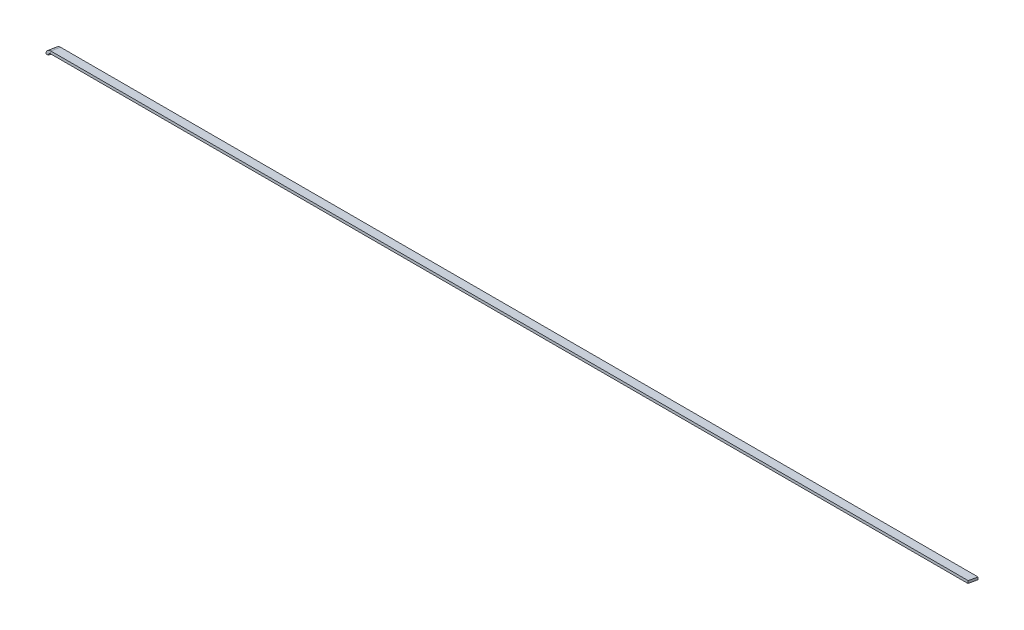
ISO-10303-21;
HEADER;
FILE_DESCRIPTION(('STEP AP214'),'2;1');
FILE_NAME('part.step','',(''),(''),'','','');
FILE_SCHEMA(('AUTOMOTIVE_DESIGN { 1 0 10303 214 1 1 1 1 }'));
ENDSEC;
DATA;
#1=APPLICATION_CONTEXT('core data for automotive mechanical design processes');
#2=APPLICATION_PROTOCOL_DEFINITION('international standard','automotive_design',2000,#1);
#3=PRODUCT_CONTEXT('',#1,'mechanical');
#4=PRODUCT('Part','Part','',(#3));
#5=PRODUCT_RELATED_PRODUCT_CATEGORY('part','',(#4));
#6=PRODUCT_DEFINITION_FORMATION('','',#4);
#7=PRODUCT_DEFINITION_CONTEXT('part definition',#1,'design');
#8=PRODUCT_DEFINITION('design','',#6,#7);
#9=PRODUCT_DEFINITION_SHAPE('','',#8);
#10=(LENGTH_UNIT() NAMED_UNIT(*) SI_UNIT(.MILLI.,.METRE.));
#11=(NAMED_UNIT(*) PLANE_ANGLE_UNIT() SI_UNIT($,.RADIAN.));
#12=(NAMED_UNIT(*) SI_UNIT($,.STERADIAN.) SOLID_ANGLE_UNIT());
#13=UNCERTAINTY_MEASURE_WITH_UNIT(LENGTH_MEASURE(1.E-05),#10,'distance_accuracy_value','');
#14=(GEOMETRIC_REPRESENTATION_CONTEXT(3) GLOBAL_UNCERTAINTY_ASSIGNED_CONTEXT((#13)) GLOBAL_UNIT_ASSIGNED_CONTEXT((#10,
#11,#12)) REPRESENTATION_CONTEXT('',''));
#15=CARTESIAN_POINT('',(0.,0.,0.));
#16=DIRECTION('',(0.,0.,1.));
#17=DIRECTION('',(1.,0.,0.));
#18=AXIS2_PLACEMENT_3D('',#15,#16,#17);
#19=CARTESIAN_POINT('',(52.41935881812,-96.32813489201,-536.6847549942));
#20=DIRECTION('',(-0.0868265938642471,0.0868265938642471,0.992432509138967));
#21=DIRECTION('',(0.996194698091746,0.,0.0871557427476577));
#22=AXIS2_PLACEMENT_3D('',#19,#20,#21);
#23=CYLINDRICAL_SURFACE('',#22,0.5);
#24=DIRECTION('',(0.0868267461894329,-0.0868265927071715,-0.99243249591346));
#25=VECTOR('',#24,1.);
#26=CARTESIAN_POINT('',(-5.17197063873012,-38.2387079825568,121.543576195394));
#27=LINE('',#26,#25);
#28=CARTESIAN_POINT('',(-5.17197055575533,-38.2387079591977,121.543576462841));
#29=VERTEX_POINT('',#28);
#30=CARTESIAN_POINT('',(-5.01067835047329,-38.4000000719543,119.699999176918));
#31=VERTEX_POINT('',#30);
#32=EDGE_CURVE('E95',#29,#31,#27,.T.);
#33=ORIENTED_EDGE('',*,*,#32,.F.);
#34=CARTESIAN_POINT('',(-5.17197040511566,-38.2387078125537,121.543578138599));
#35=CARTESIAN_POINT('',(-5.19972220287751,-38.2384726883979,121.54595633283));
#36=CARTESIAN_POINT('',(-5.22751840218116,-38.240583946407,121.54803719256));
#37=CARTESIAN_POINT('',(-5.28240384099066,-38.2493878052973,121.551648781658));
#38=CARTESIAN_POINT('',(-5.30949328184964,-38.2560790862169,121.553179669333));
#39=CARTESIAN_POINT('',(-5.3622110479099,-38.2739399330749,121.555738370536));
#40=CARTESIAN_POINT('',(-5.38783797892337,-38.2851136932458,121.556765710891));
#41=CARTESIAN_POINT('',(-5.43683707376779,-38.3116355321225,121.558341634583));
#42=CARTESIAN_POINT('',(-5.46021006185181,-38.3269820769646,121.558890393528));
#43=CARTESIAN_POINT('',(-5.50378872979201,-38.3612397034985,121.55952664386));
#44=CARTESIAN_POINT('',(-5.52402501260756,-38.3801117772388,121.559618905135));
#45=CARTESIAN_POINT('',(-5.56103983357595,-38.4209843724841,121.559359629411));
#46=CARTESIAN_POINT('',(-5.57781846124076,-38.4429848129769,121.559008103903));
#47=CARTESIAN_POINT('',(-5.6073857168609,-38.4893793953034,121.557846690681));
#48=CARTESIAN_POINT('',(-5.62019038736903,-38.5137633761151,121.557038684044));
#49=CARTESIAN_POINT('',(-5.64156452191768,-38.5643009598548,121.554944044324));
#50=CARTESIAN_POINT('',(-5.65013511017269,-38.5904540909469,121.55365753845));
#51=CARTESIAN_POINT('',(-5.66116406351586,-38.6367210177447,121.550980726654));
#52=CARTESIAN_POINT('',(-5.66463874149392,-38.6566063231496,121.549707498963));
#53=CARTESIAN_POINT('',(-5.66916718802389,-38.6966020435347,121.546867447155));
#54=CARTESIAN_POINT('',(-5.67022432089077,-38.7167121064986,121.545301034332));
#55=CARTESIAN_POINT('',(-5.6700682375968,-38.7368053477638,121.543577867252));
#56=B_SPLINE_CURVE_WITH_KNOTS('',3,(#34,#35,#36,#37,#38,#39,#40,#41,#42,#43,#44,#45,#46,#47,#48,
#49,#50,#51,#52,#53,#54,#55),.UNSPECIFIED.,.F.,.F.,(4,2,2,2,2,2,2,2,2,2,4),(0.,
0.0834672921241461,0.16691053911659,0.250432046318439,0.333922893462488,0.416539485111989,
0.499153937709975,0.581430408668102,0.663685022190623,0.724223293279798,0.784677266428535),.UNSPECIFIED.);
#57=CARTESIAN_POINT('',(-5.67006823754738,-38.7368053477605,121.543577867226));
#58=VERTEX_POINT('',#57);
#59=EDGE_CURVE('E24',#29,#58,#56,.T.);
#60=ORIENTED_EDGE('',*,*,#59,.T.);
#61=DIRECTION('',(-0.086826594005677,0.0868265938642385,0.992432509126595));
#62=VECTOR('',#61,1.);
#63=CARTESIAN_POINT('',(-5.50877607324944,-38.898097511743,119.699999996839));
#64=LINE('',#63,#62);
#65=CARTESIAN_POINT('',(-5.50877607296511,-38.8980975116285,119.699999991538));
#66=VERTEX_POINT('',#65);
#67=EDGE_CURVE('E101',#66,#58,#64,.T.);
#68=ORIENTED_EDGE('',*,*,#67,.F.);
#69=CARTESIAN_POINT('',(-5.50877607268078,-38.8980975115139,119.699999986236));
#70=CARTESIAN_POINT('',(-5.50879765994219,-38.8699809162158,119.700006630051));
#71=CARTESIAN_POINT('',(-5.50641474109959,-38.8418748740012,119.700010778274));
#72=CARTESIAN_POINT('',(-5.49700064036064,-38.7865418735219,119.70001584724));
#73=CARTESIAN_POINT('',(-5.48998390480496,-38.7593124581065,119.700016777959));
#74=CARTESIAN_POINT('',(-5.47157832414516,-38.7067411869035,119.700017192252));
#75=CARTESIAN_POINT('',(-5.4602458936271,-38.6813798148727,119.700016693979));
#76=CARTESIAN_POINT('',(-5.4402547992537,-38.6450858478842,119.700014385166));
#77=CARTESIAN_POINT('',(-5.43310367204059,-38.6332935093817,119.70001335769));
#78=CARTESIAN_POINT('',(-5.41023943094516,-38.5989164300088,119.700009275337));
#79=CARTESIAN_POINT('',(-5.39308067511347,-38.5772539574586,119.700005220406));
#80=CARTESIAN_POINT('',(-5.36490228404933,-38.5471851009634,119.699999971807));
#81=CARTESIAN_POINT('',(-5.35511711352177,-38.5375772416292,119.699998362797));
#82=CARTESIAN_POINT('',(-5.32454716050016,-38.5099559870637,119.699995545983));
#83=CARTESIAN_POINT('',(-5.30259283440001,-38.4932014703541,119.699996367285));
#84=CARTESIAN_POINT('',(-5.25621490225502,-38.4635632574624,119.699999743904));
#85=CARTESIAN_POINT('',(-5.23179131751778,-38.4506795278825,119.700002299206));
#86=CARTESIAN_POINT('',(-5.19388254967836,-38.4345321162787,119.700005712372));
#87=CARTESIAN_POINT('',(-5.18105159653024,-38.4296835983239,119.700006779013));
#88=CARTESIAN_POINT('',(-5.11759402120296,-38.4086491162974,119.700010960414));
#89=CARTESIAN_POINT('',(-5.06443654458955,-38.399978889005,119.700011138459));
#90=CARTESIAN_POINT('',(-5.01067811407178,-38.3999999999183,119.700000000995));
#91=B_SPLINE_CURVE_WITH_KNOTS('',3,(#69,#70,#71,#72,#73,#74,#75,#76,#77,#78,#79,#80,#81,#82,#83,
#84,#85,#86,#87,#88,#89,#90),.UNSPECIFIED.,.F.,.F.,(4,2,2,2,2,2,2,2,2,2,4),(0.,
0.0842298513350223,0.168198340399447,0.251104912953752,0.292450068290602,0.374887932500182,
0.415999833054676,0.498437726311945,0.580874908260832,0.621986558622702,0.781380797754757),.UNSPECIFIED.);
#92=EDGE_CURVE('E85',#66,#31,#91,.T.);
#93=ORIENTED_EDGE('',*,*,#92,.T.);
#94=EDGE_LOOP('',(#33,#60,#68,#93));
#95=FACE_BOUND('',#94,.T.);
#96=ADVANCED_FACE('F17',(#95),#23,.F.);
#97=CARTESIAN_POINT('',(-5.112569675134,-38.47541771009,121.5479394711));
#98=CARTESIAN_POINT('',(-5.044486580042,-38.16396532369,121.5266461423));
#99=CARTESIAN_POINT('',(-4.976403484949,-37.85251293728,121.5053528136));
#100=CARTESIAN_POINT('',(-4.908320389856,-37.54106055088,121.4840594848));
#101=CARTESIAN_POINT('',(-5.132151056064,-38.47050991599,121.5538502431));
#102=CARTESIAN_POINT('',(-5.086414288446,-38.15407199933,121.5301655596));
#103=CARTESIAN_POINT('',(-5.040677520828,-37.83763408266,121.506480876));
#104=CARTESIAN_POINT('',(-4.99494075321,-37.521196166,121.4827961925));
#105=CARTESIAN_POINT('',(-5.200266491454,-38.46164018996,121.5716413278));
#106=CARTESIAN_POINT('',(-5.232618831878,-38.13720868905,121.5404252146));
#107=CARTESIAN_POINT('',(-5.264971172301,-37.81277718814,121.5092091014));
#108=CARTESIAN_POINT('',(-5.297323512724,-37.48834568722,121.4779929882));
#109=CARTESIAN_POINT('',(-5.315120027272,-38.49030514313,121.5886289005));
#110=CARTESIAN_POINT('',(-5.480858717124,-38.20228867929,121.5489295976));
#111=CARTESIAN_POINT('',(-5.646597406976,-37.91427221545,121.5092302947));
#112=CARTESIAN_POINT('',(-5.812336096828,-37.6262557516,121.4695309918));
#113=CARTESIAN_POINT('',(-5.418451545368,-38.59361039623,121.5886484445));
#114=CARTESIAN_POINT('',(-5.706442895095,-38.42781993132,121.5489470994));
#115=CARTESIAN_POINT('',(-5.994434244823,-38.2620294664,121.5092457543));
#116=CARTESIAN_POINT('',(-6.28242559455,-38.09623900149,121.4695444091));
#117=CARTESIAN_POINT('',(-5.44741610376,-38.70959777021,121.5714819641));
#118=CARTESIAN_POINT('',(-5.772202737519,-38.67850933872,121.5403470572));
#119=CARTESIAN_POINT('',(-6.096989371278,-38.64742090723,121.5092121503));
#120=CARTESIAN_POINT('',(-6.421776005036,-38.61633247574,121.4780772434));
#121=CARTESIAN_POINT('',(-5.437965666557,-38.77887810011,121.5532562447));
#122=CARTESIAN_POINT('',(-5.754131515095,-38.82719714972,121.5298226307));
#123=CARTESIAN_POINT('',(-6.070297363634,-38.87551619933,121.5063890168));
#124=CARTESIAN_POINT('',(-6.386463212172,-38.92383524893,121.4829554028));
#125=CARTESIAN_POINT('',(-5.432504216162,-38.79952284327,121.546928232));
#126=CARTESIAN_POINT('',(-5.743086428147,-38.87138938096,121.5260431179));
#127=CARTESIAN_POINT('',(-6.053668640132,-38.94325591866,121.5051580037));
#128=CARTESIAN_POINT('',(-6.364250852116,-39.01512245635,121.4842728895));
#129=B_SPLINE_SURFACE_WITH_KNOTS('',3,3,((#97,#98,#99,#100),(#101,#102,#103,#104),(#105,#106,
#107,#108),(#109,#110,#111,#112),(#113,#114,#115,#116),(#117,#118,#119,#120),(#121,#122,#123,
#124),(#125,#126,#127,#128)),.UNSPECIFIED.,.F.,.F.,.F.,(4,1,1,1,1,4),(4,4),(0.09907117927803,
0.1856172221288,0.3946265594904,0.6036358968522,0.8126452342138,0.9040364762453),
(0.005541150635362,0.7988602237158),.UNSPECIFIED.);
#130=CARTESIAN_POINT('',(-6.16816558786832,-38.7368055089523,121.500000009887));
#131=CARTESIAN_POINT('',(-6.16816576184903,-38.7087438103357,121.500003255809));
#132=CARTESIAN_POINT('',(-6.16698621756349,-38.6806952711927,121.499978508677));
#133=CARTESIAN_POINT('',(-6.16227601287146,-38.6247971107316,121.499888428137));
#134=CARTESIAN_POINT('',(-6.15874540709441,-38.5969474848069,121.499823095672));
#135=CARTESIAN_POINT('',(-6.14465381938358,-38.5140387684586,121.499589555745));
#136=CARTESIAN_POINT('',(-6.13059300570216,-38.4595327034948,121.499383721116));
#137=CARTESIAN_POINT('',(-6.09350702592433,-38.3536545907043,121.498974860905));
#138=CARTESIAN_POINT('',(-6.0704765195511,-38.3022844310133,121.498771837071));
#139=CARTESIAN_POINT('',(-6.01609612406021,-38.2041577211165,121.49843570573));
#140=CARTESIAN_POINT('',(-5.9847481191383,-38.1574001292942,121.498302582408));
#141=CARTESIAN_POINT('',(-5.91472070695153,-38.0699526222906,121.498149602284));
#142=CARTESIAN_POINT('',(-5.87606036772105,-38.0292474070149,121.498129454977));
#143=CARTESIAN_POINT('',(-5.7924234949847,-37.9549006773107,121.498209360105));
#144=CARTESIAN_POINT('',(-5.74744707919719,-37.9212590312613,121.4983094103));
#145=CARTESIAN_POINT('',(-5.67628207925127,-37.8768463889765,121.498523817443));
#146=CARTESIAN_POINT('',(-5.65193527690781,-37.8630470235084,121.498606045184));
#147=CARTESIAN_POINT('',(-5.60219165522934,-37.8375557816904,121.498784931524));
#148=CARTESIAN_POINT('',(-5.57679579113229,-37.8258620378668,121.498881577197));
#149=CARTESIAN_POINT('',(-5.49926819178859,-37.7940591424291,121.499181947329));
#150=CARTESIAN_POINT('',(-5.44574911323243,-37.7771988493341,121.49939627453));
#151=CARTESIAN_POINT('',(-5.35526099458943,-37.75684686416,121.499699162428));
#152=CARTESIAN_POINT('',(-5.31884434890358,-37.7507596103966,121.499805714937));
#153=CARTESIAN_POINT('',(-5.24561571666127,-37.7426429227936,121.499956763468));
#154=CARTESIAN_POINT('',(-5.20880439169978,-37.7406075230348,121.500001350697));
#155=CARTESIAN_POINT('',(-5.17197069254263,-37.7406106554667,121.499998073121));
#156=B_SPLINE_CURVE_WITH_KNOTS('',3,(#130,#131,#132,#133,#134,#135,#136,#137,#138,#139,#140,
#141,#142,#143,#144,#145,#146,#147,#148,#149,#150,#151,#152,#153,#154,#155),.UNSPECIFIED.,.F.,
.F.,(4,2,2,2,2,2,2,2,2,2,2,2,4),(0.,0.0841339446855841,0.168265934496953,0.336271822615515,
0.504377889511799,0.672445907143272,0.840081557498182,1.00771408389245,1.09158418543019,
1.17537953229231,1.34280499255545,1.45336828011326,1.56376865435896),.UNSPECIFIED.);
#157=CARTESIAN_POINT('',(-6.16816558786483,-38.7368055083495,121.500000009848));
#158=VERTEX_POINT('',#157);
#159=CARTESIAN_POINT('',(-5.17197069082768,-37.740610706025,121.499997495172));
#160=VERTEX_POINT('',#159);
#161=EDGE_CURVE('E106',#158,#160,#156,.T.);
#162=DIRECTION('',(-0.996194700555619,-3.22370768909132E-07,-0.0871557145848507));
#163=VECTOR('',#162,1.);
#164=CARTESIAN_POINT('',(-5.67006823749798,-38.7368053477572,121.5435778672));
#165=LINE('',#164,#163);
#166=EDGE_CURVE('E80',#58,#158,#165,.T.);
#167=DIRECTION('',(0.,-0.996194698095335,0.0871557427066331));
#168=VECTOR('',#167,1.);
#169=CARTESIAN_POINT('',(-5.171970706395,-37.98965943124,121.5217858514));
#170=LINE('',#169,#168);
#171=EDGE_CURVE('E78',#160,#29,#170,.T.);
#172=ORIENTED_EDGE('',*,*,#161,.F.);
#173=ORIENTED_EDGE('',*,*,#166,.F.);
#174=ORIENTED_EDGE('',*,*,#59,.F.);
#175=ORIENTED_EDGE('',*,*,#171,.F.);
#176=EDGE_LOOP('',(#172,#173,#174,#175));
#177=FACE_BOUND('',#176,.T.);
#178=ADVANCED_FACE('F77',(#177),#129,.F.);
#179=CARTESIAN_POINT('',(-5.508755852196,-38.89809751128,119.7000017553));
#180=CARTESIAN_POINT('',(-5.674805654029,-38.89809756532,119.6854742735));
#181=CARTESIAN_POINT('',(-5.840855455862,-38.89809761937,119.6709467918));
#182=CARTESIAN_POINT('',(-6.006905257696,-38.89809767341,119.65641931));
#183=CARTESIAN_POINT('',(-5.508760617186,-38.8544017485,119.7000109825));
#184=CARTESIAN_POINT('',(-5.674703529684,-38.84000586102,119.6842299089));
#185=CARTESIAN_POINT('',(-5.840646442181,-38.82560997355,119.6684488354));
#186=CARTESIAN_POINT('',(-6.006589354678,-38.81121408608,119.6526677618));
#187=CARTESIAN_POINT('',(-5.49731079232,-38.76716292597,119.7000216717));
#188=CARTESIAN_POINT('',(-5.659265485849,-38.72395986644,119.6820652055));
#189=CARTESIAN_POINT('',(-5.821220179378,-38.68075680692,119.6641087393));
#190=CARTESIAN_POINT('',(-5.983174872907,-38.63755374739,119.6461522731));
#191=CARTESIAN_POINT('',(-5.446768599709,-38.64532302812,119.7000206451));
#192=CARTESIAN_POINT('',(-5.591847771949,-38.56182580232,119.6800153623));
#193=CARTESIAN_POINT('',(-5.736926944188,-38.47832857651,119.6600100796));
#194=CARTESIAN_POINT('',(-5.882006116427,-38.3948313507,119.6400047968));
#195=CARTESIAN_POINT('',(-5.367012648338,-38.5415361521,119.6999987719));
#196=CARTESIAN_POINT('',(-5.485337511826,-38.42325027185,119.6792982154));
#197=CARTESIAN_POINT('',(-5.603662375314,-38.3049643916,119.6585976588));
#198=CARTESIAN_POINT('',(-5.721987238802,-38.18667851135,119.6378971022));
#199=CARTESIAN_POINT('',(-5.262851043244,-38.4616687018,119.7000005201));
#200=CARTESIAN_POINT('',(-5.3464513903,-38.31664768838,119.6799978271));
#201=CARTESIAN_POINT('',(-5.430051737356,-38.17162667495,119.6599951341));
#202=CARTESIAN_POINT('',(-5.513652084413,-38.02660566153,119.6399924411));
#203=CARTESIAN_POINT('',(-5.141547898129,-38.41149872191,119.7000139057));
#204=CARTESIAN_POINT('',(-5.184761965535,-38.24953844761,119.6820571144));
#205=CARTESIAN_POINT('',(-5.22797603294,-38.08757817331,119.6641003231));
#206=CARTESIAN_POINT('',(-5.271190100345,-37.92561789902,119.6461435319));
#207=CARTESIAN_POINT('',(-5.054363473588,-38.40001551403,119.7000104189));
#208=CARTESIAN_POINT('',(-5.068760914962,-38.23407279721,119.6842273341));
#209=CARTESIAN_POINT('',(-5.083158356337,-38.06813008039,119.6684442492));
#210=CARTESIAN_POINT('',(-5.097555797712,-37.90218736357,119.6526611644));
#211=CARTESIAN_POINT('',(-5.010678120263,-38.40002027704,119.7000017753));
#212=CARTESIAN_POINT('',(-5.010677726776,-38.23397071732,119.6854719864));
#213=CARTESIAN_POINT('',(-5.010677333288,-38.0679211576,119.6709421975));
#214=CARTESIAN_POINT('',(-5.0106769398,-37.90187159788,119.6564124086));
#215=B_SPLINE_SURFACE_WITH_KNOTS('',3,3,((#179,#180,#181,#182),(#183,#184,#185,#186),(#187,#188,
#189,#190),(#191,#192,#193,#194),(#195,#196,#197,#198),(#199,#200,#201,#202),(#203,#204,#205,
#206),(#207,#208,#209,#210),(#211,#212,#213,#214)),.UNSPECIFIED.,.F.,.F.,.F.,(4,1,1,1,1,1,4),(4,
4),(1.056157251686E-09,0.166666542373,0.3333330847488,0.4999996271247,0.6666661695005,
0.8333327118763,1.000000000175),(0.1954688271944,0.6090043657866),.UNSPECIFIED.);
#216=CARTESIAN_POINT('',(-5.01067756782959,-37.9019032613414,119.656415151927));
#217=CARTESIAN_POINT('',(-5.03879089999284,-37.9020096389298,119.655201417866));
#218=CARTESIAN_POINT('',(-5.06688855383959,-37.9033018774696,119.654039390553));
#219=CARTESIAN_POINT('',(-5.12287868435477,-37.9082464443838,119.651825866115));
#220=CARTESIAN_POINT('',(-5.15077116876151,-37.9118986832804,119.650774364802));
#221=CARTESIAN_POINT('',(-5.23379460602849,-37.9263626386637,119.647799371945));
#222=CARTESIAN_POINT('',(-5.28836271174811,-37.9406820208983,119.646051458455));
#223=CARTESIAN_POINT('',(-5.39432263059505,-37.9782798250254,119.643081578523));
#224=CARTESIAN_POINT('',(-5.44571346069667,-38.001561003692,119.641859774165));
#225=CARTESIAN_POINT('',(-5.54386337052173,-38.0564246580137,119.639977673221));
#226=CARTESIAN_POINT('',(-5.59062338546168,-38.0880054527929,119.639317263053));
#227=CARTESIAN_POINT('',(-5.67811631648237,-38.1585161497739,119.638580806701));
#228=CARTESIAN_POINT('',(-5.71885728156375,-38.1974360761013,119.638503973063));
#229=CARTESIAN_POINT('',(-5.79324811550488,-38.2815793900994,119.638933227555));
#230=CARTESIAN_POINT('',(-5.82689811687405,-38.3268026599526,119.63943930479));
#231=CARTESIAN_POINT('',(-5.87131022550705,-38.3983385486413,119.64062047057));
#232=CARTESIAN_POINT('',(-5.88511026989943,-38.4228165576783,119.64108494187));
#233=CARTESIAN_POINT('',(-5.91059272036429,-38.4728188491364,119.642150636666));
#234=CARTESIAN_POINT('',(-5.92227699277489,-38.4983421848531,119.642751738573));
#235=CARTESIAN_POINT('',(-5.95403344501243,-38.5762425881716,119.644755802018));
#236=CARTESIAN_POINT('',(-5.97084092968444,-38.6300011672269,119.646360366334));
#237=CARTESIAN_POINT('',(-5.990817246781,-38.7197684575038,119.649387878863));
#238=CARTESIAN_POINT('',(-5.99671710736666,-38.7552086399585,119.650668658487));
#239=CARTESIAN_POINT('',(-6.00467549934502,-38.8264567755834,119.65341219305));
#240=CARTESIAN_POINT('',(-6.00673979089077,-38.8622640959392,119.654874671588));
#241=CARTESIAN_POINT('',(-6.00687342005211,-38.8980976800281,119.656422095722));
#242=B_SPLINE_CURVE_WITH_KNOTS('',3,(#216,#217,#218,#219,#220,#221,#222,#223,#224,#225,#226,
#227,#228,#229,#230,#231,#232,#233,#234,#235,#236,#237,#238,#239,#240,#241),.UNSPECIFIED.,.F.,
.F.,(4,2,2,2,2,2,2,2,2,2,2,2,4),(0.,0.0843674154354959,0.168731632330605,0.337189786488601,
0.505699802195554,0.674175716755923,0.842424256288795,1.01066965146891,1.09489400664821,
1.17904370108268,1.34716489886161,1.45483177787639,1.56233683461067),.UNSPECIFIED.);
#243=CARTESIAN_POINT('',(-5.01067743860626,-37.9019033103523,119.656414591666));
#244=VERTEX_POINT('',#243);
#245=CARTESIAN_POINT('',(-6.00687341300812,-38.8980976848366,119.656422015209));
#246=VERTEX_POINT('',#245);
#247=EDGE_CURVE('E108',#244,#246,#242,.T.);
#248=DIRECTION('',(2.3606758489733E-06,0.996193481796134,-0.087169643921053));
#249=VECTOR('',#248,1.);
#250=CARTESIAN_POINT('',(-5.01067753003187,-38.15094593746,119.67820709195));
#251=LINE('',#250,#249);
#252=EDGE_CURVE('E117',#31,#244,#251,.T.);
#253=DIRECTION('',(0.996194664734872,3.58191439242734E-07,0.0871561240168925));
#254=VECTOR('',#253,1.);
#255=CARTESIAN_POINT('',(-6.00686898019013,-38.8980976908371,119.656422322007));
#256=LINE('',#255,#254);
#257=EDGE_CURVE('E113',#246,#66,#256,.T.);
#258=ORIENTED_EDGE('',*,*,#247,.F.);
#259=ORIENTED_EDGE('',*,*,#252,.F.);
#260=ORIENTED_EDGE('',*,*,#92,.F.);
#261=ORIENTED_EDGE('',*,*,#257,.F.);
#262=EDGE_LOOP('',(#258,#259,#260,#261));
#263=FACE_BOUND('',#262,.T.);
#264=ADVANCED_FACE('F19',(#263),#215,.F.);
#265=CARTESIAN_POINT('',(-5.838470830963,-38.81745151012,120.6000000059));
#266=DIRECTION('',(-0.00756711390195972,-0.996223440096563,0.0864962206652068));
#267=DIRECTION('',(0.,-0.086498697210814,-0.996251963802748));
#268=AXIS2_PLACEMENT_3D('',#265,#266,#267);
#269=PLANE('',#268);
#270=ORIENTED_EDGE('',*,*,#257,.T.);
#271=ORIENTED_EDGE('',*,*,#67,.T.);
#272=ORIENTED_EDGE('',*,*,#166,.T.);
#273=DIRECTION('',(-0.0868265938642471,0.0868265938642471,0.992432509138967));
#274=VECTOR('',#273,1.);
#275=CARTESIAN_POINT('',(51.4231641175976,-96.3281352120042,-536.771910709165));
#276=LINE('',#275,#274);
#277=EDGE_CURVE('E138',#246,#158,#276,.T.);
#278=ORIENTED_EDGE('',*,*,#277,.F.);
#279=EDGE_LOOP('',(#270,#271,#272,#278));
#280=FACE_BOUND('',#279,.T.);
#281=ADVANCED_FACE('F156',(#280),#269,.T.);
#282=CARTESIAN_POINT('',(204.,-38.4,119.7));
#283=DIRECTION('',(0.,-0.996194698091745,0.0871557427476639));
#284=DIRECTION('',(0.,-0.0871557427476639,-0.996194698091745));
#285=AXIS2_PLACEMENT_3D('',#282,#283,#284);
#286=PLANE('',#285);
#287=CARTESIAN_POINT('',(185.021905441796,-38.4000011890685,119.699986408884));
#288=CARTESIAN_POINT('',(184.997492983545,-38.3818675111208,119.907255296268));
#289=CARTESIAN_POINT('',(184.9503910992,-38.3457413352215,120.320179376296));
#290=CARTESIAN_POINT('',(184.8902791195,-38.2919508790352,120.935007103895));
#291=CARTESIAN_POINT('',(184.846488197179,-38.2564059113309,121.341287943855));
#292=CARTESIAN_POINT('',(184.824558960468,-38.2387081395227,121.543574401265));
#293=(BOUNDED_CURVE() B_SPLINE_CURVE(3,(#287,#288,#289,#290,#291,#292),.UNSPECIFIED.,.F.,
.F.) B_SPLINE_CURVE_WITH_KNOTS((4,1,1,4),(0.05459839538634,0.3509431186191,0.6472878418519,
0.9436325650847),
.UNSPECIFIED.) CURVE() GEOMETRIC_REPRESENTATION_ITEM() RATIONAL_B_SPLINE_CURVE((1.,1.,1.,1.,1.,1.)) REPRESENTATION_ITEM(''));
#294=CARTESIAN_POINT('',(185.021904492009,-38.4000001440487,119.699998352845));
#295=VERTEX_POINT('',#294);
#296=CARTESIAN_POINT('',(184.824558903865,-38.238708099842,121.543574855239));
#297=VERTEX_POINT('',#296);
#298=EDGE_CURVE('E105',#295,#297,#293,.T.);
#299=ORIENTED_EDGE('',*,*,#298,.T.);
#300=DIRECTION('',(1.,0.,0.));
#301=VECTOR('',#300,1.);
#302=CARTESIAN_POINT('',(89.82629415056,-38.2387081058417,121.543574787083));
#303=LINE('',#302,#301);
#304=EDGE_CURVE('E91',#29,#297,#303,.T.);
#305=ORIENTED_EDGE('',*,*,#304,.F.);
#306=ORIENTED_EDGE('',*,*,#32,.T.);
#307=DIRECTION('',(1.,0.,0.));
#308=VECTOR('',#307,1.);
#309=CARTESIAN_POINT('',(90.00561389428,-38.4000001439904,119.69999835284));
#310=LINE('',#309,#308);
#311=EDGE_CURVE('E111',#295,#31,#310,.F.);
#312=ORIENTED_EDGE('',*,*,#311,.F.);
#313=EDGE_LOOP('',(#299,#305,#306,#312));
#314=FACE_BOUND('',#313,.T.);
#315=ADVANCED_FACE('F104',(#314),#286,.T.);
#316=CARTESIAN_POINT('',(89.82629415056,-37.98965943124,121.5217858514));
#317=DIRECTION('',(0.,0.0871557427066331,0.996194698095335));
#318=DIRECTION('',(0.,-0.996194698095335,0.0871557427066331));
#319=AXIS2_PLACEMENT_3D('',#316,#317,#318);
#320=PLANE('',#319);
#321=ORIENTED_EDGE('',*,*,#171,.T.);
#322=ORIENTED_EDGE('',*,*,#304,.T.);
#323=DIRECTION('',(0.,0.996194698091233,-0.0871557427535129));
#324=VECTOR('',#323,1.);
#325=CARTESIAN_POINT('',(184.824558903865,-38.709676284928,121.584779300999));
#326=LINE('',#325,#324);
#327=CARTESIAN_POINT('',(184.824558914483,-37.7406107505303,121.499996986409));
#328=VERTEX_POINT('',#327);
#329=EDGE_CURVE('E126',#297,#328,#326,.T.);
#330=ORIENTED_EDGE('',*,*,#329,.T.);
#331=DIRECTION('',(1.,0.,0.));
#332=VECTOR('',#331,1.);
#333=CARTESIAN_POINT('',(204.,-37.7406107562703,121.4999969208));
#334=LINE('',#333,#332);
#335=EDGE_CURVE('E94',#328,#160,#334,.F.);
#336=ORIENTED_EDGE('',*,*,#335,.T.);
#337=EDGE_LOOP('',(#321,#322,#330,#336));
#338=FACE_BOUND('',#337,.T.);
#339=ADVANCED_FACE('F88',(#338),#320,.T.);
#340=CARTESIAN_POINT('',(52.41935881812,-96.32813489201,-536.6847549942));
#341=DIRECTION('',(-0.0868265938642471,0.0868265938642471,0.992432509138967));
#342=DIRECTION('',(0.996194698091746,0.,0.0871557427476577));
#343=AXIS2_PLACEMENT_3D('',#340,#341,#342);
#344=CYLINDRICAL_SURFACE('',#343,1.);
#345=ORIENTED_EDGE('',*,*,#247,.T.);
#346=ORIENTED_EDGE('',*,*,#277,.T.);
#347=ORIENTED_EDGE('',*,*,#161,.T.);
#348=DIRECTION('',(0.0868266628970024,-0.0868265933398729,-0.992432503145258));
#349=VECTOR('',#348,1.);
#350=CARTESIAN_POINT('',(-5.17197070639511,-37.7406107218873,121.4999973138));
#351=LINE('',#350,#349);
#352=EDGE_CURVE('E201',#160,#244,#351,.T.);
#353=ORIENTED_EDGE('',*,*,#352,.T.);
#354=EDGE_LOOP('',(#345,#346,#347,#353));
#355=FACE_BOUND('',#354,.T.);
#356=ADVANCED_FACE('F143',(#355),#344,.T.);
#357=CARTESIAN_POINT('',(90.00561389428,-38.15095177591,119.6782059158));
#358=DIRECTION('',(0.,-0.0871697481922907,-0.996193472674908));
#359=DIRECTION('',(0.,0.996193472674908,-0.0871697481922907));
#360=AXIS2_PLACEMENT_3D('',#357,#358,#359);
#361=PLANE('',#360);
#362=DIRECTION('',(0.,0.996193472674908,-0.0871697481922907));
#363=VECTOR('',#362,1.);
#364=CARTESIAN_POINT('',(185.021904949,-38.15095177591,119.6782059158));
#365=LINE('',#364,#363);
#366=CARTESIAN_POINT('',(185.021905195398,-37.9019036123721,119.656411139516));
#367=VERTEX_POINT('',#366);
#368=EDGE_CURVE('E43',#367,#295,#365,.F.);
#369=ORIENTED_EDGE('',*,*,#368,.T.);
#370=ORIENTED_EDGE('',*,*,#311,.T.);
#371=ORIENTED_EDGE('',*,*,#252,.T.);
#372=DIRECTION('',(1.,0.,0.));
#373=VECTOR('',#372,1.);
#374=CARTESIAN_POINT('',(204.,-37.9019033617341,119.6564140043));
#375=LINE('',#374,#373);
#376=EDGE_CURVE('E35',#244,#367,#375,.T.);
#377=ORIENTED_EDGE('',*,*,#376,.T.);
#378=EDGE_LOOP('',(#369,#370,#371,#377));
#379=FACE_BOUND('',#378,.T.);
#380=ADVANCED_FACE('F148',(#379),#361,.T.);
#381=CARTESIAN_POINT('',(185.0354807884,-38.88099941207,119.6265469973));
#382=CARTESIAN_POINT('',(185.0309301621,-38.87765365479,119.6647891779));
#383=CARTESIAN_POINT('',(185.0018319967,-38.85616363601,119.9104212166));
#384=CARTESIAN_POINT('',(184.9503910992,-38.81670952631,120.3613837539));
#385=CARTESIAN_POINT('',(184.8902791195,-38.76291907013,120.9762114815));
#386=CARTESIAN_POINT('',(184.8423234833,-38.72399361595,121.4211314586));
#387=CARTESIAN_POINT('',(184.8162154619,-38.70294648252,121.6617012945));
#388=CARTESIAN_POINT('',(184.8120480407,-38.69958558468,121.7001165326));
#389=(BOUNDED_CURVE() B_SPLINE_CURVE(3,(#381,#382,#383,#384,#385,#386,#387,#388),.UNSPECIFIED.,
.F.,.F.) B_SPLINE_CURVE_WITH_KNOTS((4,1,1,1,1,4),(0.,0.05459839538634,0.3509431186191,
0.6472878418519,0.9436325650847,1.),
.UNSPECIFIED.) CURVE() GEOMETRIC_REPRESENTATION_ITEM() RATIONAL_B_SPLINE_CURVE((1.,1.,1.,1.,1.,
1.,1.,1.)) REPRESENTATION_ITEM(''));
#390=DIRECTION('',(0.,0.996194698091233,-0.0871557427535129));
#391=VECTOR('',#390,1.);
#392=SURFACE_OF_LINEAR_EXTRUSION('',#389,#391);
#393=CARTESIAN_POINT('',(185.021905441796,-37.9019038400166,119.656408537507));
#394=CARTESIAN_POINT('',(184.997492983545,-37.8837701620688,119.863677424891));
#395=CARTESIAN_POINT('',(184.9503910992,-37.8476439861696,120.276601504918));
#396=CARTESIAN_POINT('',(184.8902791195,-37.7938535299832,120.891429232518));
#397=CARTESIAN_POINT('',(184.846488197179,-37.7583085622789,121.297710072478));
#398=CARTESIAN_POINT('',(184.824558960468,-37.7406107904707,121.499996529888));
#399=(BOUNDED_CURVE() B_SPLINE_CURVE(3,(#393,#394,#395,#396,#397,#398),.UNSPECIFIED.,.F.,
.F.) B_SPLINE_CURVE_WITH_KNOTS((4,1,1,4),(0.05459839538634,0.3509431186191,0.6472878418519,
0.9436325650847),
.UNSPECIFIED.) CURVE() GEOMETRIC_REPRESENTATION_ITEM() RATIONAL_B_SPLINE_CURVE((1.,1.,1.,1.,1.,1.)) REPRESENTATION_ITEM(''));
#400=EDGE_CURVE('E11',#367,#328,#399,.T.);
#401=ORIENTED_EDGE('',*,*,#400,.T.);
#402=ORIENTED_EDGE('',*,*,#329,.F.);
#403=ORIENTED_EDGE('',*,*,#298,.F.);
#404=ORIENTED_EDGE('',*,*,#368,.F.);
#405=EDGE_LOOP('',(#401,#402,#403,#404));
#406=FACE_BOUND('',#405,.T.);
#407=ADVANCED_FACE('F183',(#406),#392,.F.);
#408=CARTESIAN_POINT('',(204.,-37.90190265095,119.6564221286));
#409=DIRECTION('',(0.,-0.996194698091745,0.0871557427476639));
#410=DIRECTION('',(0.,-0.0871557427476639,-0.996194698091745));
#411=AXIS2_PLACEMENT_3D('',#408,#409,#410);
#412=PLANE('',#411);
#413=ORIENTED_EDGE('',*,*,#376,.F.);
#414=ORIENTED_EDGE('',*,*,#352,.F.);
#415=ORIENTED_EDGE('',*,*,#335,.F.);
#416=ORIENTED_EDGE('',*,*,#400,.F.);
#417=EDGE_LOOP('',(#413,#414,#415,#416));
#418=FACE_BOUND('',#417,.T.);
#419=ADVANCED_FACE('F181',(#418),#412,.F.);
#420=CLOSED_SHELL('',(#96,#178,#264,#281,#315,#339,#356,#380,#407,#419));
#421=MANIFOLD_SOLID_BREP('B1',#420);
#422=ADVANCED_BREP_SHAPE_REPRESENTATION('',(#18,#421),#14);
#423=SHAPE_DEFINITION_REPRESENTATION(#9,#422);
ENDSEC;
END-ISO-10303-21;
